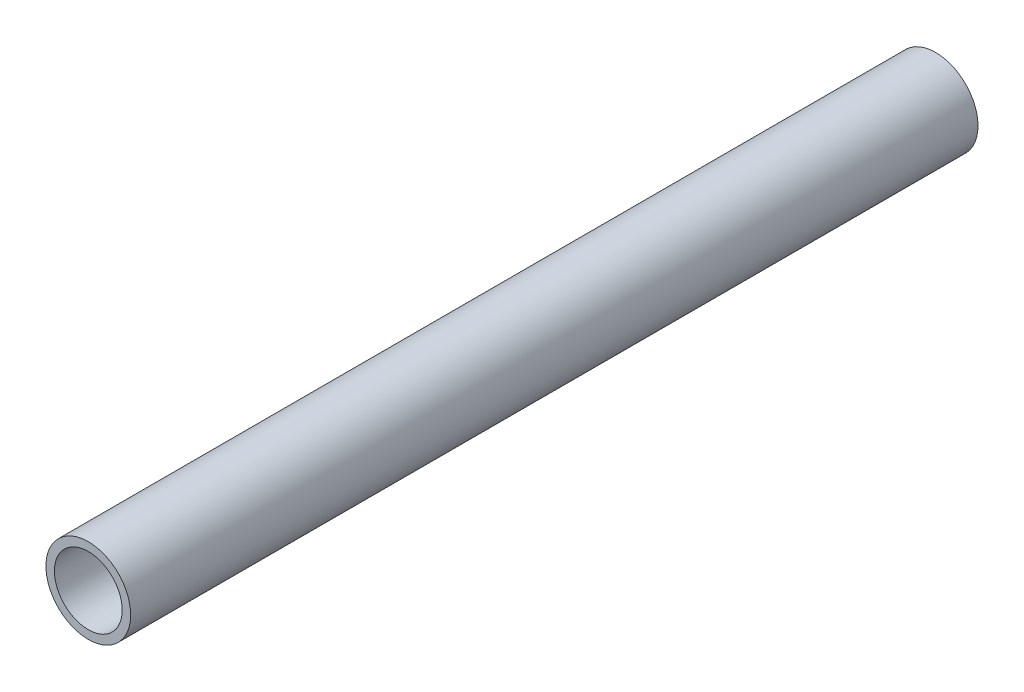
ISO-10303-21;
HEADER;
FILE_DESCRIPTION(('STEP AP214'),'2;1');
FILE_NAME('part.step','',(''),(''),'','','');
FILE_SCHEMA(('AUTOMOTIVE_DESIGN { 1 0 10303 214 1 1 1 1 }'));
ENDSEC;
DATA;
#1=APPLICATION_CONTEXT('core data for automotive mechanical design processes');
#2=APPLICATION_PROTOCOL_DEFINITION('international standard','automotive_design',2000,#1);
#3=PRODUCT_CONTEXT('',#1,'mechanical');
#4=PRODUCT('Part','Part','',(#3));
#5=PRODUCT_RELATED_PRODUCT_CATEGORY('part','',(#4));
#6=PRODUCT_DEFINITION_FORMATION('','',#4);
#7=PRODUCT_DEFINITION_CONTEXT('part definition',#1,'design');
#8=PRODUCT_DEFINITION('design','',#6,#7);
#9=PRODUCT_DEFINITION_SHAPE('','',#8);
#10=(LENGTH_UNIT() NAMED_UNIT(*) SI_UNIT(.MILLI.,.METRE.));
#11=(NAMED_UNIT(*) PLANE_ANGLE_UNIT() SI_UNIT($,.RADIAN.));
#12=(NAMED_UNIT(*) SI_UNIT($,.STERADIAN.) SOLID_ANGLE_UNIT());
#13=UNCERTAINTY_MEASURE_WITH_UNIT(LENGTH_MEASURE(1.E-05),#10,'distance_accuracy_value','');
#14=(GEOMETRIC_REPRESENTATION_CONTEXT(3) GLOBAL_UNCERTAINTY_ASSIGNED_CONTEXT((#13)) GLOBAL_UNIT_ASSIGNED_CONTEXT((#10,
#11,#12)) REPRESENTATION_CONTEXT('',''));
#15=CARTESIAN_POINT('',(0.,0.,0.));
#16=DIRECTION('',(0.,0.,1.));
#17=DIRECTION('',(1.,0.,0.));
#18=AXIS2_PLACEMENT_3D('',#15,#16,#17);
#19=CARTESIAN_POINT('',(0.,0.,100.));
#20=DIRECTION('',(0.,0.,1.));
#21=DIRECTION('',(1.,0.,0.));
#22=AXIS2_PLACEMENT_3D('',#19,#20,#21);
#23=PLANE('',#22);
#24=CARTESIAN_POINT('',(0.,0.,100.));
#25=DIRECTION('',(0.,0.,1.));
#26=DIRECTION('',(1.,0.,0.));
#27=AXIS2_PLACEMENT_3D('',#24,#25,#26);
#28=CIRCLE('',#27,5.);
#29=CARTESIAN_POINT('',(5.,0.,100.));
#30=VERTEX_POINT('',#29);
#31=EDGE_CURVE('E10',#30,#30,#28,.T.);
#32=ORIENTED_EDGE('',*,*,#31,.T.);
#33=EDGE_LOOP('',(#32));
#34=FACE_BOUND('',#33,.T.);
#35=CARTESIAN_POINT('',(0.,0.,100.));
#36=DIRECTION('',(0.,0.,1.));
#37=DIRECTION('',(1.,0.,0.));
#38=AXIS2_PLACEMENT_3D('',#35,#36,#37);
#39=CIRCLE('',#38,4.);
#40=CARTESIAN_POINT('',(4.,0.,100.));
#41=VERTEX_POINT('',#40);
#42=EDGE_CURVE('E44',#41,#41,#39,.T.);
#43=ORIENTED_EDGE('',*,*,#42,.F.);
#44=EDGE_LOOP('',(#43));
#45=FACE_BOUND('',#44,.T.);
#46=ADVANCED_FACE('F33',(#34,#45),#23,.T.);
#47=CARTESIAN_POINT('',(0.,0.,0.));
#48=DIRECTION('',(0.,0.,1.));
#49=DIRECTION('',(1.,0.,0.));
#50=AXIS2_PLACEMENT_3D('',#47,#48,#49);
#51=PLANE('',#50);
#52=CARTESIAN_POINT('',(0.,0.,0.));
#53=DIRECTION('',(0.,0.,1.));
#54=DIRECTION('',(1.,0.,0.));
#55=AXIS2_PLACEMENT_3D('',#52,#53,#54);
#56=CIRCLE('',#55,5.);
#57=CARTESIAN_POINT('',(5.,0.,0.));
#58=VERTEX_POINT('',#57);
#59=EDGE_CURVE('E37',#58,#58,#56,.T.);
#60=ORIENTED_EDGE('',*,*,#59,.F.);
#61=EDGE_LOOP('',(#60));
#62=FACE_BOUND('',#61,.T.);
#63=CARTESIAN_POINT('',(0.,0.,0.));
#64=DIRECTION('',(0.,0.,1.));
#65=DIRECTION('',(1.,0.,0.));
#66=AXIS2_PLACEMENT_3D('',#63,#64,#65);
#67=CIRCLE('',#66,4.);
#68=CARTESIAN_POINT('',(4.,0.,0.));
#69=VERTEX_POINT('',#68);
#70=EDGE_CURVE('E46',#69,#69,#67,.T.);
#71=ORIENTED_EDGE('',*,*,#70,.T.);
#72=EDGE_LOOP('',(#71));
#73=FACE_BOUND('',#72,.T.);
#74=ADVANCED_FACE('F56',(#62,#73),#51,.F.);
#75=CARTESIAN_POINT('',(0.,0.,100.));
#76=DIRECTION('',(0.,0.,-1.));
#77=DIRECTION('',(-1.,0.,0.));
#78=AXIS2_PLACEMENT_3D('',#75,#76,#77);
#79=CYLINDRICAL_SURFACE('',#78,5.);
#80=ORIENTED_EDGE('',*,*,#31,.F.);
#81=EDGE_LOOP('',(#80));
#82=FACE_BOUND('',#81,.T.);
#83=ORIENTED_EDGE('',*,*,#59,.T.);
#84=EDGE_LOOP('',(#83));
#85=FACE_BOUND('',#84,.T.);
#86=ADVANCED_FACE('F35',(#82,#85),#79,.T.);
#87=CARTESIAN_POINT('',(0.,0.,100.));
#88=DIRECTION('',(0.,0.,-1.));
#89=DIRECTION('',(-1.,0.,0.));
#90=AXIS2_PLACEMENT_3D('',#87,#88,#89);
#91=CYLINDRICAL_SURFACE('',#90,4.);
#92=ORIENTED_EDGE('',*,*,#42,.T.);
#93=EDGE_LOOP('',(#92));
#94=FACE_BOUND('',#93,.T.);
#95=ORIENTED_EDGE('',*,*,#70,.F.);
#96=EDGE_LOOP('',(#95));
#97=FACE_BOUND('',#96,.T.);
#98=ADVANCED_FACE('F52',(#94,#97),#91,.F.);
#99=CLOSED_SHELL('',(#46,#74,#86,#98));
#100=MANIFOLD_SOLID_BREP('B2',#99);
#101=ADVANCED_BREP_SHAPE_REPRESENTATION('',(#18,#100),#14);
#102=SHAPE_DEFINITION_REPRESENTATION(#9,#101);
ENDSEC;
END-ISO-10303-21;
